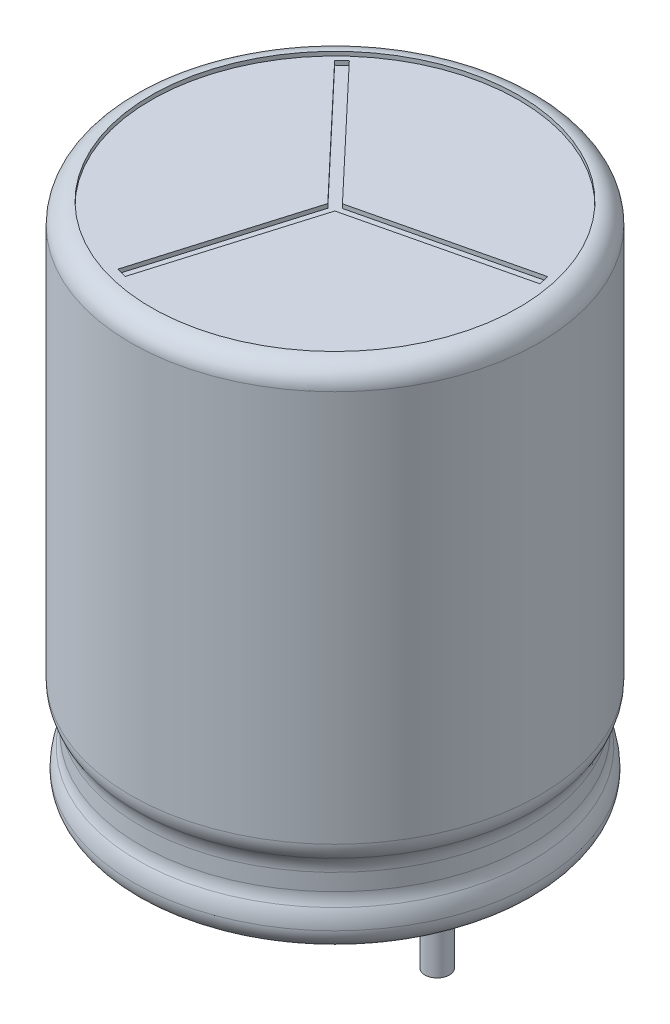
ISO-10303-21;
HEADER;
FILE_DESCRIPTION(('STEP AP214'),'2;1');
FILE_NAME('part.step','',(''),(''),'','','');
FILE_SCHEMA(('AUTOMOTIVE_DESIGN { 1 0 10303 214 1 1 1 1 }'));
ENDSEC;
DATA;
#1=APPLICATION_CONTEXT('core data for automotive mechanical design processes');
#2=APPLICATION_PROTOCOL_DEFINITION('international standard','automotive_design',2000,#1);
#3=PRODUCT_CONTEXT('',#1,'mechanical');
#4=PRODUCT('Part','Part','',(#3));
#5=PRODUCT_RELATED_PRODUCT_CATEGORY('part','',(#4));
#6=PRODUCT_DEFINITION_FORMATION('','',#4);
#7=PRODUCT_DEFINITION_CONTEXT('part definition',#1,'design');
#8=PRODUCT_DEFINITION('design','',#6,#7);
#9=PRODUCT_DEFINITION_SHAPE('','',#8);
#10=(LENGTH_UNIT() NAMED_UNIT(*) SI_UNIT(.MILLI.,.METRE.));
#11=(NAMED_UNIT(*) PLANE_ANGLE_UNIT() SI_UNIT($,.RADIAN.));
#12=(NAMED_UNIT(*) SI_UNIT($,.STERADIAN.) SOLID_ANGLE_UNIT());
#13=UNCERTAINTY_MEASURE_WITH_UNIT(LENGTH_MEASURE(1.E-05),#10,'distance_accuracy_value','');
#14=(GEOMETRIC_REPRESENTATION_CONTEXT(3) GLOBAL_UNCERTAINTY_ASSIGNED_CONTEXT((#13)) GLOBAL_UNIT_ASSIGNED_CONTEXT((#10,
#11,#12)) REPRESENTATION_CONTEXT('',''));
#15=CARTESIAN_POINT('',(0.,0.,0.));
#16=DIRECTION('',(0.,0.,1.));
#17=DIRECTION('',(1.,0.,0.));
#18=AXIS2_PLACEMENT_3D('',#15,#16,#17);
#19=CARTESIAN_POINT('',(0.,12.5,0.));
#20=DIRECTION('',(0.,-1.,0.));
#21=DIRECTION('',(0.,0.,-1.));
#22=AXIS2_PLACEMENT_3D('',#19,#20,#21);
#23=CYLINDRICAL_SURFACE('',#22,5.);
#24=CARTESIAN_POINT('',(0.,12.,0.));
#25=DIRECTION('',(0.,1.,0.));
#26=DIRECTION('',(0.,0.,1.));
#27=AXIS2_PLACEMENT_3D('',#24,#25,#26);
#28=CIRCLE('',#27,5.);
#29=CARTESIAN_POINT('',(0.,12.,5.));
#30=VERTEX_POINT('',#29);
#31=EDGE_CURVE('E199',#30,#30,#28,.F.);
#32=ORIENTED_EDGE('',*,*,#31,.T.);
#33=EDGE_LOOP('',(#32));
#34=FACE_BOUND('',#33,.T.);
#35=CARTESIAN_POINT('',(0.,2.40756880196224,0.));
#36=DIRECTION('',(0.,-1.,0.));
#37=DIRECTION('',(0.,0.,-1.));
#38=AXIS2_PLACEMENT_3D('',#35,#36,#37);
#39=CIRCLE('',#38,5.);
#40=CARTESIAN_POINT('',(0.,2.40756880196224,-5.));
#41=VERTEX_POINT('',#40);
#42=EDGE_CURVE('E179',#41,#41,#39,.T.);
#43=ORIENTED_EDGE('',*,*,#42,.F.);
#44=EDGE_LOOP('',(#43));
#45=FACE_BOUND('',#44,.T.);
#46=ADVANCED_FACE('F34',(#34,#45),#23,.T.);
#47=CARTESIAN_POINT('',(0.,0.,0.));
#48=DIRECTION('',(0.,-1.,0.));
#49=DIRECTION('',(0.,0.,-1.));
#50=AXIS2_PLACEMENT_3D('',#47,#48,#49);
#51=PLANE('',#50);
#52=CARTESIAN_POINT('',(-2.5,0.,0.));
#53=DIRECTION('',(0.,-1.,0.));
#54=DIRECTION('',(0.,0.,-1.));
#55=AXIS2_PLACEMENT_3D('',#52,#53,#54);
#56=CIRCLE('',#55,0.3);
#57=CARTESIAN_POINT('',(-2.5,0.,-0.3));
#58=VERTEX_POINT('',#57);
#59=EDGE_CURVE('E11',#58,#58,#56,.T.);
#60=ORIENTED_EDGE('',*,*,#59,.F.);
#61=EDGE_LOOP('',(#60));
#62=FACE_BOUND('',#61,.T.);
#63=CARTESIAN_POINT('',(0.,0.,0.));
#64=DIRECTION('',(0.,-1.,0.));
#65=DIRECTION('',(0.,0.,-1.));
#66=AXIS2_PLACEMENT_3D('',#63,#64,#65);
#67=CIRCLE('',#66,4.43271930739619);
#68=CARTESIAN_POINT('',(0.,0.,-4.43271930739619));
#69=VERTEX_POINT('',#68);
#70=EDGE_CURVE('E202',#69,#69,#67,.T.);
#71=ORIENTED_EDGE('',*,*,#70,.T.);
#72=EDGE_LOOP('',(#71));
#73=FACE_BOUND('',#72,.T.);
#74=CARTESIAN_POINT('',(2.5,0.,0.));
#75=DIRECTION('',(0.,-1.,0.));
#76=DIRECTION('',(0.,0.,-1.));
#77=AXIS2_PLACEMENT_3D('',#74,#75,#76);
#78=CIRCLE('',#77,0.3);
#79=CARTESIAN_POINT('',(2.5,0.,-0.3));
#80=VERTEX_POINT('',#79);
#81=EDGE_CURVE('E196',#80,#80,#78,.T.);
#82=ORIENTED_EDGE('',*,*,#81,.F.);
#83=EDGE_LOOP('',(#82));
#84=FACE_BOUND('',#83,.T.);
#85=ADVANCED_FACE('F216',(#62,#73,#84),#51,.T.);
#86=CARTESIAN_POINT('',(0.,0.470350245927735,0.));
#87=DIRECTION('',(0.,-1.,0.));
#88=DIRECTION('',(0.,0.,-1.));
#89=AXIS2_PLACEMENT_3D('',#86,#87,#88);
#90=TOROIDAL_SURFACE('',#89,3.83892521840495,1.09453387459209);
#91=CARTESIAN_POINT('',(0.,0.524935294134929,0.));
#92=DIRECTION('',(0.,-1.,0.));
#93=DIRECTION('',(0.,0.,-1.));
#94=AXIS2_PLACEMENT_3D('',#91,#92,#93);
#95=CIRCLE('',#94,4.93209715142454);
#96=CARTESIAN_POINT('',(0.,0.524935294134929,-4.93209715142454));
#97=VERTEX_POINT('',#96);
#98=EDGE_CURVE('E42',#97,#97,#95,.F.);
#99=ORIENTED_EDGE('',*,*,#98,.T.);
#100=EDGE_LOOP('',(#99));
#101=FACE_BOUND('',#100,.T.);
#102=CARTESIAN_POINT('',(0.,0.942947155233674,0.));
#103=DIRECTION('',(0.,-1.,0.));
#104=DIRECTION('',(0.,0.,-1.));
#105=AXIS2_PLACEMENT_3D('',#102,#103,#104);
#106=CIRCLE('',#105,4.82617218038764);
#107=CARTESIAN_POINT('',(0.,0.942947155233674,-4.82617218038764));
#108=VERTEX_POINT('',#107);
#109=EDGE_CURVE('E193',#108,#108,#106,.T.);
#110=ORIENTED_EDGE('',*,*,#109,.T.);
#111=EDGE_LOOP('',(#110));
#112=FACE_BOUND('',#111,.T.);
#113=ADVANCED_FACE('F207',(#101,#112),#90,.T.);
#114=CARTESIAN_POINT('',(0.,1.23259900370742,0.));
#115=DIRECTION('',(0.,-1.,0.));
#116=DIRECTION('',(0.,0.,-1.));
#117=AXIS2_PLACEMENT_3D('',#114,#115,#116);
#118=TOROIDAL_SURFACE('',#117,5.43125,0.670833333333332);
#119=CARTESIAN_POINT('',(0.,1.23259900370742,0.));
#120=DIRECTION('',(0.,-1.,0.));
#121=DIRECTION('',(0.,0.,-1.));
#122=AXIS2_PLACEMENT_3D('',#119,#120,#121);
#123=CIRCLE('',#122,4.76041666666667);
#124=CARTESIAN_POINT('',(0.,1.23259900370742,-4.76041666666667));
#125=VERTEX_POINT('',#124);
#126=EDGE_CURVE('E190',#125,#125,#123,.T.);
#127=ORIENTED_EDGE('',*,*,#126,.T.);
#128=EDGE_LOOP('',(#127));
#129=FACE_BOUND('',#128,.T.);
#130=ORIENTED_EDGE('',*,*,#109,.F.);
#131=EDGE_LOOP('',(#130));
#132=FACE_BOUND('',#131,.T.);
#133=ADVANCED_FACE('F278',(#129,#132),#118,.F.);
#134=CARTESIAN_POINT('',(0.,12.5,0.));
#135=DIRECTION('',(0.,-1.,0.));
#136=DIRECTION('',(0.,0.,-1.));
#137=AXIS2_PLACEMENT_3D('',#134,#135,#136);
#138=CYLINDRICAL_SURFACE('',#137,4.76041666666667);
#139=CARTESIAN_POINT('',(0.,1.64240099629258,0.));
#140=DIRECTION('',(0.,-1.,0.));
#141=DIRECTION('',(0.,0.,-1.));
#142=AXIS2_PLACEMENT_3D('',#139,#140,#141);
#143=CIRCLE('',#142,4.76041666666667);
#144=CARTESIAN_POINT('',(0.,1.64240099629258,-4.76041666666667));
#145=VERTEX_POINT('',#144);
#146=EDGE_CURVE('E187',#145,#145,#143,.T.);
#147=ORIENTED_EDGE('',*,*,#146,.T.);
#148=EDGE_LOOP('',(#147));
#149=FACE_BOUND('',#148,.T.);
#150=ORIENTED_EDGE('',*,*,#126,.F.);
#151=EDGE_LOOP('',(#150));
#152=FACE_BOUND('',#151,.T.);
#153=ADVANCED_FACE('F274',(#149,#152),#138,.T.);
#154=CARTESIAN_POINT('',(0.,1.64240099629258,0.));
#155=DIRECTION('',(0.,-1.,0.));
#156=DIRECTION('',(0.,0.,-1.));
#157=AXIS2_PLACEMENT_3D('',#154,#155,#156);
#158=TOROIDAL_SURFACE('',#157,5.43125,0.670833333333334);
#159=CARTESIAN_POINT('',(0.,2.02498489912741,0.));
#160=DIRECTION('',(0.,-1.,0.));
#161=DIRECTION('',(0.,0.,-1.));
#162=AXIS2_PLACEMENT_3D('',#159,#160,#161);
#163=CIRCLE('',#162,4.88020833333333);
#164=CARTESIAN_POINT('',(0.,2.02498489912741,-4.88020833333333));
#165=VERTEX_POINT('',#164);
#166=EDGE_CURVE('E184',#165,#165,#163,.T.);
#167=ORIENTED_EDGE('',*,*,#166,.T.);
#168=EDGE_LOOP('',(#167));
#169=FACE_BOUND('',#168,.T.);
#170=ORIENTED_EDGE('',*,*,#146,.F.);
#171=EDGE_LOOP('',(#170));
#172=FACE_BOUND('',#171,.T.);
#173=ADVANCED_FACE('F266',(#169,#172),#158,.F.);
#174=CARTESIAN_POINT('',(0.,2.40756880196224,0.));
#175=DIRECTION('',(0.,-1.,0.));
#176=DIRECTION('',(0.,0.,-1.));
#177=AXIS2_PLACEMENT_3D('',#174,#175,#176);
#178=TOROIDAL_SURFACE('',#177,4.32916666666667,0.670833333333331);
#179=ORIENTED_EDGE('',*,*,#42,.T.);
#180=EDGE_LOOP('',(#179));
#181=FACE_BOUND('',#180,.T.);
#182=ORIENTED_EDGE('',*,*,#166,.F.);
#183=EDGE_LOOP('',(#182));
#184=FACE_BOUND('',#183,.T.);
#185=ADVANCED_FACE('F256',(#181,#184),#178,.T.);
#186=CARTESIAN_POINT('',(0.,12.4,0.));
#187=DIRECTION('',(0.,1.,0.));
#188=DIRECTION('',(0.,0.,1.));
#189=AXIS2_PLACEMENT_3D('',#186,#187,#188);
#190=CYLINDRICAL_SURFACE('',#189,4.5);
#191=CARTESIAN_POINT('',(0.,12.4,0.));
#192=DIRECTION('',(0.,1.,0.));
#193=DIRECTION('',(0.,0.,-1.));
#194=AXIS2_PLACEMENT_3D('',#191,#192,#193);
#195=CIRCLE('',#194,4.5);
#196=CARTESIAN_POINT('',(0.,12.4,-4.5));
#197=VERTEX_POINT('',#196);
#198=EDGE_CURVE('E176',#197,#197,#195,.T.);
#199=ORIENTED_EDGE('',*,*,#198,.F.);
#200=EDGE_LOOP('',(#199));
#201=FACE_BOUND('',#200,.T.);
#202=CARTESIAN_POINT('',(0.,12.5,0.));
#203=DIRECTION('',(0.,1.,0.));
#204=DIRECTION('',(0.,0.,-1.));
#205=AXIS2_PLACEMENT_3D('',#202,#203,#204);
#206=CIRCLE('',#205,4.5);
#207=CARTESIAN_POINT('',(0.,12.5,-4.5));
#208=VERTEX_POINT('',#207);
#209=EDGE_CURVE('E164',#208,#208,#206,.T.);
#210=ORIENTED_EDGE('',*,*,#209,.T.);
#211=EDGE_LOOP('',(#210));
#212=FACE_BOUND('',#211,.T.);
#213=ADVANCED_FACE('F253',(#201,#212),#190,.F.);
#214=CARTESIAN_POINT('',(0.,12.4,0.));
#215=DIRECTION('',(0.,-1.,0.));
#216=DIRECTION('',(0.,0.,-1.));
#217=AXIS2_PLACEMENT_3D('',#214,#215,#216);
#218=PLANE('',#217);
#219=DIRECTION('',(-0.726380713563257,0.,0.687292557040547));
#220=VECTOR('',#219,1.);
#221=CARTESIAN_POINT('',(-2.90603662225935,12.4,-3.25609368585913));
#222=LINE('',#221,#220);
#223=CARTESIAN_POINT('',(-2.90603662225935,12.4,-3.25609368585913));
#224=VERTEX_POINT('',#223);
#225=CARTESIAN_POINT('',(-3.09053732350442,12.4,-3.08152137637083));
#226=VERTEX_POINT('',#225);
#227=EDGE_CURVE('E141',#224,#226,#222,.T.);
#228=ORIENTED_EDGE('',*,*,#227,.F.);
#229=DIRECTION('',(-0.687292557040547,0.,-0.726380713563257));
#230=VECTOR('',#229,1.);
#231=CARTESIAN_POINT('',(0.0418556656844751,12.4,-0.140546919508894));
#232=LINE('',#231,#230);
#233=CARTESIAN_POINT('',(0.0418556656844751,12.4,-0.140546919508894));
#234=VERTEX_POINT('',#233);
#235=EDGE_CURVE('E49',#234,#224,#232,.T.);
#236=ORIENTED_EDGE('',*,*,#235,.F.);
#237=DIRECTION('',(-0.972710429285123,0.,0.232022457447447));
#238=VECTOR('',#237,1.);
#239=CARTESIAN_POINT('',(4.09665425880726,12.4,-1.10774569286042));
#240=LINE('',#239,#238);
#241=CARTESIAN_POINT('',(4.09665425880726,12.4,-1.10774569286042));
#242=VERTEX_POINT('',#241);
#243=EDGE_CURVE('E160',#242,#234,#240,.T.);
#244=ORIENTED_EDGE('',*,*,#243,.F.);
#245=DIRECTION('',(-0.232022457447447,0.,-0.972710429285123));
#246=VECTOR('',#245,1.);
#247=CARTESIAN_POINT('',(4.15558796299891,12.4,-0.860677243821993));
#248=LINE('',#247,#246);
#249=CARTESIAN_POINT('',(4.15558796299891,12.4,-0.860677243821993));
#250=VERTEX_POINT('',#249);
#251=EDGE_CURVE('E158',#250,#242,#248,.T.);
#252=ORIENTED_EDGE('',*,*,#251,.F.);
#253=DIRECTION('',(0.972710429285123,0.,-0.232022457447447));
#254=VECTOR('',#253,1.);
#255=CARTESIAN_POINT('',(0.100789369876127,12.4,0.106521529529527));
#256=LINE('',#255,#254);
#257=CARTESIAN_POINT('',(0.100789369876127,12.4,0.106521529529527));
#258=VERTEX_POINT('',#257);
#259=EDGE_CURVE('E115',#258,#250,#256,.T.);
#260=ORIENTED_EDGE('',*,*,#259,.F.);
#261=DIRECTION('',(0.285417872244571,0.,-0.958403171010709));
#262=VECTOR('',#261,1.);
#263=CARTESIAN_POINT('',(-1.07721556960452,12.4,4.06213811578557));
#264=LINE('',#263,#262);
#265=CARTESIAN_POINT('',(-1.07721556960452,12.4,4.06213811578557));
#266=VERTEX_POINT('',#265);
#267=EDGE_CURVE('E154',#266,#258,#264,.T.);
#268=ORIENTED_EDGE('',*,*,#267,.F.);
#269=DIRECTION('',(0.958403171010708,0.,0.285417872244572));
#270=VECTOR('',#269,1.);
#271=CARTESIAN_POINT('',(-1.32064997504124,12.4,3.98964197623545));
#272=LINE('',#271,#270);
#273=CARTESIAN_POINT('',(-1.32064997504124,12.4,3.98964197623545));
#274=VERTEX_POINT('',#273);
#275=EDGE_CURVE('E151',#274,#266,#272,.T.);
#276=ORIENTED_EDGE('',*,*,#275,.F.);
#277=DIRECTION('',(-0.285417872244571,0.,0.958403171010709));
#278=VECTOR('',#277,1.);
#279=CARTESIAN_POINT('',(-0.142645035560593,12.4,0.0340253899794046));
#280=LINE('',#279,#278);
#281=CARTESIAN_POINT('',(-0.142645035560593,12.4,0.0340253899794046));
#282=VERTEX_POINT('',#281);
#283=EDGE_CURVE('E148',#282,#274,#280,.T.);
#284=ORIENTED_EDGE('',*,*,#283,.F.);
#285=DIRECTION('',(0.687292557040547,0.,0.726380713563257));
#286=VECTOR('',#285,1.);
#287=CARTESIAN_POINT('',(-3.09053732350442,12.4,-3.08152137637083));
#288=LINE('',#287,#286);
#289=EDGE_CURVE('E145',#226,#282,#288,.T.);
#290=ORIENTED_EDGE('',*,*,#289,.F.);
#291=EDGE_LOOP('',(#228,#236,#244,#252,#260,#268,#276,#284,#290));
#292=FACE_BOUND('',#291,.T.);
#293=ORIENTED_EDGE('',*,*,#198,.T.);
#294=EDGE_LOOP('',(#293));
#295=FACE_BOUND('',#294,.T.);
#296=ADVANCED_FACE('F255',(#292,#295),#218,.F.);
#297=CARTESIAN_POINT('',(0.0418556656844751,12.3,-0.140546919508894));
#298=DIRECTION('',(0.726380713563257,0.,-0.687292557040547));
#299=DIRECTION('',(-0.687292557040547,0.,-0.726380713563257));
#300=AXIS2_PLACEMENT_3D('',#297,#298,#299);
#301=PLANE('',#300);
#302=ORIENTED_EDGE('',*,*,#235,.T.);
#303=DIRECTION('',(0.,1.,0.));
#304=VECTOR('',#303,1.);
#305=CARTESIAN_POINT('',(-2.90603662225935,12.3,-3.25609368585913));
#306=LINE('',#305,#304);
#307=CARTESIAN_POINT('',(-2.90603662225935,12.3,-3.25609368585913));
#308=VERTEX_POINT('',#307);
#309=EDGE_CURVE('E88',#308,#224,#306,.T.);
#310=ORIENTED_EDGE('',*,*,#309,.F.);
#311=DIRECTION('',(-0.687292557040547,0.,-0.726380713563257));
#312=VECTOR('',#311,1.);
#313=CARTESIAN_POINT('',(0.0418556656844751,12.3,-0.140546919508894));
#314=LINE('',#313,#312);
#315=CARTESIAN_POINT('',(0.0418556656844751,12.3,-0.140546919508894));
#316=VERTEX_POINT('',#315);
#317=EDGE_CURVE('E162',#316,#308,#314,.T.);
#318=ORIENTED_EDGE('',*,*,#317,.F.);
#319=DIRECTION('',(0.,1.,0.));
#320=VECTOR('',#319,1.);
#321=CARTESIAN_POINT('',(0.0418556656844751,12.3,-0.140546919508894));
#322=LINE('',#321,#320);
#323=EDGE_CURVE('E57',#316,#234,#322,.T.);
#324=ORIENTED_EDGE('',*,*,#323,.T.);
#325=EDGE_LOOP('',(#302,#310,#318,#324));
#326=FACE_BOUND('',#325,.T.);
#327=ADVANCED_FACE('F263',(#326),#301,.F.);
#328=CARTESIAN_POINT('',(4.09665425880726,12.3,-1.10774569286042));
#329=DIRECTION('',(-0.232022457447447,0.,-0.972710429285123));
#330=DIRECTION('',(-0.972710429285123,0.,0.232022457447447));
#331=AXIS2_PLACEMENT_3D('',#328,#329,#330);
#332=PLANE('',#331);
#333=ORIENTED_EDGE('',*,*,#243,.T.);
#334=ORIENTED_EDGE('',*,*,#323,.F.);
#335=DIRECTION('',(-0.972710429285123,0.,0.232022457447447));
#336=VECTOR('',#335,1.);
#337=CARTESIAN_POINT('',(4.09665425880726,12.3,-1.10774569286042));
#338=LINE('',#337,#336);
#339=CARTESIAN_POINT('',(4.09665425880726,12.3,-1.10774569286042));
#340=VERTEX_POINT('',#339);
#341=EDGE_CURVE('E127',#340,#316,#338,.T.);
#342=ORIENTED_EDGE('',*,*,#341,.F.);
#343=DIRECTION('',(0.,1.,0.));
#344=VECTOR('',#343,1.);
#345=CARTESIAN_POINT('',(4.09665425880726,12.3,-1.10774569286042));
#346=LINE('',#345,#344);
#347=EDGE_CURVE('E119',#340,#242,#346,.T.);
#348=ORIENTED_EDGE('',*,*,#347,.T.);
#349=EDGE_LOOP('',(#333,#334,#342,#348));
#350=FACE_BOUND('',#349,.T.);
#351=ADVANCED_FACE('F322',(#350),#332,.F.);
#352=CARTESIAN_POINT('',(4.15558796299891,12.3,-0.860677243821993));
#353=DIRECTION('',(0.972710429285123,0.,-0.232022457447447));
#354=DIRECTION('',(-0.232022457447447,0.,-0.972710429285123));
#355=AXIS2_PLACEMENT_3D('',#352,#353,#354);
#356=PLANE('',#355);
#357=ORIENTED_EDGE('',*,*,#251,.T.);
#358=ORIENTED_EDGE('',*,*,#347,.F.);
#359=DIRECTION('',(-0.232022457447447,0.,-0.972710429285123));
#360=VECTOR('',#359,1.);
#361=CARTESIAN_POINT('',(4.15558796299891,12.3,-0.860677243821993));
#362=LINE('',#361,#360);
#363=CARTESIAN_POINT('',(4.15558796299891,12.3,-0.860677243821993));
#364=VERTEX_POINT('',#363);
#365=EDGE_CURVE('E123',#364,#340,#362,.T.);
#366=ORIENTED_EDGE('',*,*,#365,.F.);
#367=DIRECTION('',(0.,1.,0.));
#368=VECTOR('',#367,1.);
#369=CARTESIAN_POINT('',(4.15558796299891,12.3,-0.860677243821993));
#370=LINE('',#369,#368);
#371=EDGE_CURVE('E108',#364,#250,#370,.T.);
#372=ORIENTED_EDGE('',*,*,#371,.T.);
#373=EDGE_LOOP('',(#357,#358,#366,#372));
#374=FACE_BOUND('',#373,.T.);
#375=ADVANCED_FACE('F124',(#374),#356,.F.);
#376=CARTESIAN_POINT('',(0.100789369876127,12.3,0.106521529529527));
#377=DIRECTION('',(0.232022457447447,0.,0.972710429285123));
#378=DIRECTION('',(0.972710429285123,0.,-0.232022457447447));
#379=AXIS2_PLACEMENT_3D('',#376,#377,#378);
#380=PLANE('',#379);
#381=ORIENTED_EDGE('',*,*,#259,.T.);
#382=ORIENTED_EDGE('',*,*,#371,.F.);
#383=DIRECTION('',(0.972710429285123,0.,-0.232022457447447));
#384=VECTOR('',#383,1.);
#385=CARTESIAN_POINT('',(0.100789369876127,12.3,0.106521529529527));
#386=LINE('',#385,#384);
#387=CARTESIAN_POINT('',(0.100789369876127,12.3,0.106521529529527));
#388=VERTEX_POINT('',#387);
#389=EDGE_CURVE('E112',#388,#364,#386,.T.);
#390=ORIENTED_EDGE('',*,*,#389,.F.);
#391=DIRECTION('',(0.,1.,0.));
#392=VECTOR('',#391,1.);
#393=CARTESIAN_POINT('',(0.100789369876127,12.3,0.106521529529527));
#394=LINE('',#393,#392);
#395=EDGE_CURVE('E120',#388,#258,#394,.T.);
#396=ORIENTED_EDGE('',*,*,#395,.T.);
#397=EDGE_LOOP('',(#381,#382,#390,#396));
#398=FACE_BOUND('',#397,.T.);
#399=ADVANCED_FACE('F110',(#398),#380,.F.);
#400=CARTESIAN_POINT('',(-1.07721556960452,12.3,4.06213811578557));
#401=DIRECTION('',(0.958403171010709,0.,0.285417872244571));
#402=DIRECTION('',(0.285417872244571,0.,-0.958403171010709));
#403=AXIS2_PLACEMENT_3D('',#400,#401,#402);
#404=PLANE('',#403);
#405=ORIENTED_EDGE('',*,*,#267,.T.);
#406=ORIENTED_EDGE('',*,*,#395,.F.);
#407=DIRECTION('',(0.285417872244571,0.,-0.958403171010709));
#408=VECTOR('',#407,1.);
#409=CARTESIAN_POINT('',(-1.07721556960452,12.3,4.06213811578557));
#410=LINE('',#409,#408);
#411=CARTESIAN_POINT('',(-1.07721556960452,12.3,4.06213811578557));
#412=VERTEX_POINT('',#411);
#413=EDGE_CURVE('E133',#412,#388,#410,.T.);
#414=ORIENTED_EDGE('',*,*,#413,.F.);
#415=DIRECTION('',(0.,1.,0.));
#416=VECTOR('',#415,1.);
#417=CARTESIAN_POINT('',(-1.07721556960452,12.3,4.06213811578557));
#418=LINE('',#417,#416);
#419=EDGE_CURVE('E167',#412,#266,#418,.T.);
#420=ORIENTED_EDGE('',*,*,#419,.T.);
#421=EDGE_LOOP('',(#405,#406,#414,#420));
#422=FACE_BOUND('',#421,.T.);
#423=ADVANCED_FACE('F346',(#422),#404,.F.);
#424=CARTESIAN_POINT('',(-1.32064997504124,12.3,3.98964197623545));
#425=DIRECTION('',(-0.285417872244572,0.,0.958403171010708));
#426=DIRECTION('',(0.958403171010708,0.,0.285417872244572));
#427=AXIS2_PLACEMENT_3D('',#424,#425,#426);
#428=PLANE('',#427);
#429=ORIENTED_EDGE('',*,*,#275,.T.);
#430=ORIENTED_EDGE('',*,*,#419,.F.);
#431=DIRECTION('',(0.958403171010708,0.,0.285417872244572));
#432=VECTOR('',#431,1.);
#433=CARTESIAN_POINT('',(-1.32064997504124,12.3,3.98964197623545));
#434=LINE('',#433,#432);
#435=CARTESIAN_POINT('',(-1.32064997504124,12.3,3.98964197623545));
#436=VERTEX_POINT('',#435);
#437=EDGE_CURVE('E135',#436,#412,#434,.T.);
#438=ORIENTED_EDGE('',*,*,#437,.F.);
#439=DIRECTION('',(0.,1.,0.));
#440=VECTOR('',#439,1.);
#441=CARTESIAN_POINT('',(-1.32064997504124,12.3,3.98964197623545));
#442=LINE('',#441,#440);
#443=EDGE_CURVE('E169',#436,#274,#442,.T.);
#444=ORIENTED_EDGE('',*,*,#443,.T.);
#445=EDGE_LOOP('',(#429,#430,#438,#444));
#446=FACE_BOUND('',#445,.T.);
#447=ADVANCED_FACE('F355',(#446),#428,.F.);
#448=CARTESIAN_POINT('',(-0.142645035560593,12.3,0.0340253899794046));
#449=DIRECTION('',(-0.958403171010709,0.,-0.285417872244571));
#450=DIRECTION('',(-0.285417872244571,0.,0.958403171010709));
#451=AXIS2_PLACEMENT_3D('',#448,#449,#450);
#452=PLANE('',#451);
#453=ORIENTED_EDGE('',*,*,#283,.T.);
#454=ORIENTED_EDGE('',*,*,#443,.F.);
#455=DIRECTION('',(-0.285417872244571,0.,0.958403171010709));
#456=VECTOR('',#455,1.);
#457=CARTESIAN_POINT('',(-0.142645035560593,12.3,0.0340253899794046));
#458=LINE('',#457,#456);
#459=CARTESIAN_POINT('',(-0.142645035560593,12.3,0.0340253899794046));
#460=VERTEX_POINT('',#459);
#461=EDGE_CURVE('E476',#460,#436,#458,.T.);
#462=ORIENTED_EDGE('',*,*,#461,.F.);
#463=DIRECTION('',(0.,1.,0.));
#464=VECTOR('',#463,1.);
#465=CARTESIAN_POINT('',(-0.142645035560593,12.3,0.0340253899794046));
#466=LINE('',#465,#464);
#467=EDGE_CURVE('E171',#460,#282,#466,.T.);
#468=ORIENTED_EDGE('',*,*,#467,.T.);
#469=EDGE_LOOP('',(#453,#454,#462,#468));
#470=FACE_BOUND('',#469,.T.);
#471=ADVANCED_FACE('F365',(#470),#452,.F.);
#472=CARTESIAN_POINT('',(-3.09053732350442,12.3,-3.08152137637083));
#473=DIRECTION('',(-0.726380713563257,0.,0.687292557040547));
#474=DIRECTION('',(0.687292557040547,0.,0.726380713563257));
#475=AXIS2_PLACEMENT_3D('',#472,#473,#474);
#476=PLANE('',#475);
#477=ORIENTED_EDGE('',*,*,#289,.T.);
#478=ORIENTED_EDGE('',*,*,#467,.F.);
#479=DIRECTION('',(0.687292557040547,0.,0.726380713563257));
#480=VECTOR('',#479,1.);
#481=CARTESIAN_POINT('',(-3.09053732350442,12.3,-3.08152137637083));
#482=LINE('',#481,#480);
#483=CARTESIAN_POINT('',(-3.09053732350442,12.3,-3.08152137637083));
#484=VERTEX_POINT('',#483);
#485=EDGE_CURVE('E473',#484,#460,#482,.T.);
#486=ORIENTED_EDGE('',*,*,#485,.F.);
#487=DIRECTION('',(0.,1.,0.));
#488=VECTOR('',#487,1.);
#489=CARTESIAN_POINT('',(-3.09053732350442,12.3,-3.08152137637083));
#490=LINE('',#489,#488);
#491=EDGE_CURVE('E173',#484,#226,#490,.T.);
#492=ORIENTED_EDGE('',*,*,#491,.T.);
#493=EDGE_LOOP('',(#477,#478,#486,#492));
#494=FACE_BOUND('',#493,.T.);
#495=ADVANCED_FACE('F375',(#494),#476,.F.);
#496=CARTESIAN_POINT('',(-2.90603662225935,12.3,-3.25609368585913));
#497=DIRECTION('',(-0.687292557040547,0.,-0.726380713563257));
#498=DIRECTION('',(-0.726380713563257,0.,0.687292557040547));
#499=AXIS2_PLACEMENT_3D('',#496,#497,#498);
#500=PLANE('',#499);
#501=ORIENTED_EDGE('',*,*,#227,.T.);
#502=ORIENTED_EDGE('',*,*,#491,.F.);
#503=DIRECTION('',(-0.726380713563257,0.,0.687292557040547));
#504=VECTOR('',#503,1.);
#505=CARTESIAN_POINT('',(-2.90603662225935,12.3,-3.25609368585913));
#506=LINE('',#505,#504);
#507=EDGE_CURVE('E470',#308,#484,#506,.T.);
#508=ORIENTED_EDGE('',*,*,#507,.F.);
#509=ORIENTED_EDGE('',*,*,#309,.T.);
#510=EDGE_LOOP('',(#501,#502,#508,#509));
#511=FACE_BOUND('',#510,.T.);
#512=ADVANCED_FACE('F235',(#511),#500,.F.);
#513=CARTESIAN_POINT('',(0.,12.3,0.));
#514=DIRECTION('',(0.,1.,0.));
#515=DIRECTION('',(0.,0.,1.));
#516=AXIS2_PLACEMENT_3D('',#513,#514,#515);
#517=PLANE('',#516);
#518=ORIENTED_EDGE('',*,*,#317,.T.);
#519=ORIENTED_EDGE('',*,*,#507,.T.);
#520=ORIENTED_EDGE('',*,*,#485,.T.);
#521=ORIENTED_EDGE('',*,*,#461,.T.);
#522=ORIENTED_EDGE('',*,*,#437,.T.);
#523=ORIENTED_EDGE('',*,*,#413,.T.);
#524=ORIENTED_EDGE('',*,*,#389,.T.);
#525=ORIENTED_EDGE('',*,*,#365,.T.);
#526=ORIENTED_EDGE('',*,*,#341,.T.);
#527=EDGE_LOOP('',(#518,#519,#520,#521,#522,#523,#524,#525,#526));
#528=FACE_BOUND('',#527,.T.);
#529=ADVANCED_FACE('F130',(#528),#517,.T.);
#530=CARTESIAN_POINT('',(2.5,-2.5,0.));
#531=DIRECTION('',(0.,1.,0.));
#532=DIRECTION('',(0.,0.,1.));
#533=AXIS2_PLACEMENT_3D('',#530,#531,#532);
#534=CYLINDRICAL_SURFACE('',#533,0.3);
#535=CARTESIAN_POINT('',(2.5,-2.5,0.));
#536=DIRECTION('',(0.,1.,0.));
#537=DIRECTION('',(0.,0.,1.));
#538=AXIS2_PLACEMENT_3D('',#535,#536,#537);
#539=CIRCLE('',#538,0.3);
#540=CARTESIAN_POINT('',(2.5,-2.5,0.3));
#541=VERTEX_POINT('',#540);
#542=EDGE_CURVE('E142',#541,#541,#539,.T.);
#543=ORIENTED_EDGE('',*,*,#542,.T.);
#544=EDGE_LOOP('',(#543));
#545=FACE_BOUND('',#544,.T.);
#546=ORIENTED_EDGE('',*,*,#81,.T.);
#547=EDGE_LOOP('',(#546));
#548=FACE_BOUND('',#547,.T.);
#549=ADVANCED_FACE('F223',(#545,#548),#534,.T.);
#550=CARTESIAN_POINT('',(2.8,-2.5,0.));
#551=DIRECTION('',(0.,-1.,0.));
#552=DIRECTION('',(0.,0.,-1.));
#553=AXIS2_PLACEMENT_3D('',#550,#551,#552);
#554=PLANE('',#553);
#555=ORIENTED_EDGE('',*,*,#542,.F.);
#556=EDGE_LOOP('',(#555));
#557=FACE_BOUND('',#556,.T.);
#558=ADVANCED_FACE('F225',(#557),#554,.T.);
#559=CARTESIAN_POINT('',(0.,12.,0.));
#560=DIRECTION('',(0.,1.,0.));
#561=DIRECTION('',(0.,0.,1.));
#562=AXIS2_PLACEMENT_3D('',#559,#560,#561);
#563=TOROIDAL_SURFACE('',#562,4.5,0.5);
#564=ORIENTED_EDGE('',*,*,#209,.F.);
#565=EDGE_LOOP('',(#564));
#566=FACE_BOUND('',#565,.T.);
#567=ORIENTED_EDGE('',*,*,#31,.F.);
#568=EDGE_LOOP('',(#567));
#569=FACE_BOUND('',#568,.T.);
#570=ADVANCED_FACE('F213',(#566,#569),#563,.T.);
#571=CARTESIAN_POINT('',(0.,0.5,0.));
#572=DIRECTION('',(0.,-1.,0.));
#573=DIRECTION('',(0.,0.,-1.));
#574=AXIS2_PLACEMENT_3D('',#571,#572,#573);
#575=TOROIDAL_SURFACE('',#574,4.43271930739619,0.5);
#576=ORIENTED_EDGE('',*,*,#98,.F.);
#577=EDGE_LOOP('',(#576));
#578=FACE_BOUND('',#577,.T.);
#579=ORIENTED_EDGE('',*,*,#70,.F.);
#580=EDGE_LOOP('',(#579));
#581=FACE_BOUND('',#580,.T.);
#582=ADVANCED_FACE('F36',(#578,#581),#575,.T.);
#583=CARTESIAN_POINT('',(-2.5,-2.5,0.));
#584=DIRECTION('',(0.,1.,0.));
#585=DIRECTION('',(0.,0.,1.));
#586=AXIS2_PLACEMENT_3D('',#583,#584,#585);
#587=CYLINDRICAL_SURFACE('',#586,0.3);
#588=CARTESIAN_POINT('',(-2.5,-2.5,0.));
#589=DIRECTION('',(0.,-1.,0.));
#590=DIRECTION('',(0.,0.,1.));
#591=AXIS2_PLACEMENT_3D('',#588,#589,#590);
#592=CIRCLE('',#591,0.3);
#593=CARTESIAN_POINT('',(-2.5,-2.5,0.3));
#594=VERTEX_POINT('',#593);
#595=EDGE_CURVE('E465',#594,#594,#592,.T.);
#596=ORIENTED_EDGE('',*,*,#595,.F.);
#597=EDGE_LOOP('',(#596));
#598=FACE_BOUND('',#597,.T.);
#599=ORIENTED_EDGE('',*,*,#59,.T.);
#600=EDGE_LOOP('',(#599));
#601=FACE_BOUND('',#600,.T.);
#602=ADVANCED_FACE('F212',(#598,#601),#587,.T.);
#603=CARTESIAN_POINT('',(-2.8,-2.5,0.));
#604=DIRECTION('',(0.,-1.,0.));
#605=DIRECTION('',(0.,0.,-1.));
#606=AXIS2_PLACEMENT_3D('',#603,#604,#605);
#607=PLANE('',#606);
#608=ORIENTED_EDGE('',*,*,#595,.T.);
#609=EDGE_LOOP('',(#608));
#610=FACE_BOUND('',#609,.T.);
#611=ADVANCED_FACE('F446',(#610),#607,.T.);
#612=CLOSED_SHELL('',(#46,#85,#113,#133,#153,#173,#185,#213,#296,#327,#351,#375,#399,#423,#447,
#471,#495,#512,#529,#549,#558,#570,#582,#602,#611));
#613=MANIFOLD_SOLID_BREP('B2',#612);
#614=ADVANCED_BREP_SHAPE_REPRESENTATION('',(#18,#613),#14);
#615=SHAPE_DEFINITION_REPRESENTATION(#9,#614);
ENDSEC;
END-ISO-10303-21;
